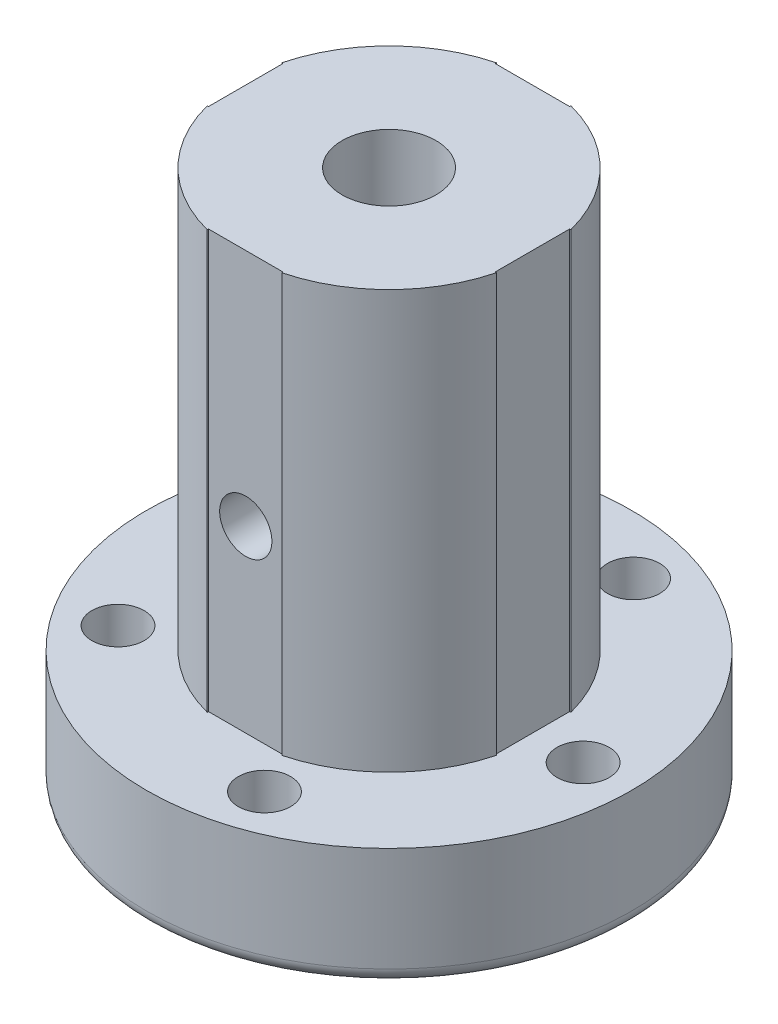
ISO-10303-21;
HEADER;
FILE_DESCRIPTION(('STEP AP214'),'2;1');
FILE_NAME('part.step','',(''),(''),'','','');
FILE_SCHEMA(('AUTOMOTIVE_DESIGN { 1 0 10303 214 1 1 1 1 }'));
ENDSEC;
DATA;
#1=APPLICATION_CONTEXT('core data for automotive mechanical design processes');
#2=APPLICATION_PROTOCOL_DEFINITION('international standard','automotive_design',2000,#1);
#3=PRODUCT_CONTEXT('',#1,'mechanical');
#4=PRODUCT('Part','Part','',(#3));
#5=PRODUCT_RELATED_PRODUCT_CATEGORY('part','',(#4));
#6=PRODUCT_DEFINITION_FORMATION('','',#4);
#7=PRODUCT_DEFINITION_CONTEXT('part definition',#1,'design');
#8=PRODUCT_DEFINITION('design','',#6,#7);
#9=PRODUCT_DEFINITION_SHAPE('','',#8);
#10=(LENGTH_UNIT() NAMED_UNIT(*) SI_UNIT(.MILLI.,.METRE.));
#11=(NAMED_UNIT(*) PLANE_ANGLE_UNIT() SI_UNIT($,.RADIAN.));
#12=(NAMED_UNIT(*) SI_UNIT($,.STERADIAN.) SOLID_ANGLE_UNIT());
#13=UNCERTAINTY_MEASURE_WITH_UNIT(LENGTH_MEASURE(1.E-05),#10,'distance_accuracy_value','');
#14=(GEOMETRIC_REPRESENTATION_CONTEXT(3) GLOBAL_UNCERTAINTY_ASSIGNED_CONTEXT((#13)) GLOBAL_UNIT_ASSIGNED_CONTEXT((#10,
#11,#12)) REPRESENTATION_CONTEXT('',''));
#15=CARTESIAN_POINT('',(0.,0.,0.));
#16=DIRECTION('',(0.,0.,1.));
#17=DIRECTION('',(1.,0.,0.));
#18=AXIS2_PLACEMENT_3D('',#15,#16,#17);
#19=CARTESIAN_POINT('',(0.,36.,0.));
#20=DIRECTION('',(0.,-1.,0.));
#21=DIRECTION('',(0.,0.,-1.));
#22=AXIS2_PLACEMENT_3D('',#19,#20,#21);
#23=CYLINDRICAL_SURFACE('',#22,10.);
#24=CARTESIAN_POINT('',(0.,36.,0.));
#25=DIRECTION('',(0.,1.,0.));
#26=DIRECTION('',(0.,0.,1.));
#27=AXIS2_PLACEMENT_3D('',#24,#25,#26);
#28=CIRCLE('',#27,10.);
#29=CARTESIAN_POINT('',(2.49999999999997,36.,9.68245836551855));
#30=VERTEX_POINT('',#29);
#31=CARTESIAN_POINT('',(9.68245836551854,36.,2.5));
#32=VERTEX_POINT('',#31);
#33=EDGE_CURVE('E315',#30,#32,#28,.T.);
#34=ORIENTED_EDGE('',*,*,#33,.F.);
#35=DIRECTION('',(0.,-1.,0.));
#36=VECTOR('',#35,1.);
#37=CARTESIAN_POINT('',(2.49999999999997,36.,9.68245836551855));
#38=LINE('',#37,#36);
#39=CARTESIAN_POINT('',(2.49999999999997,8.,9.68245836551855));
#40=VERTEX_POINT('',#39);
#41=EDGE_CURVE('E272',#30,#40,#38,.T.);
#42=ORIENTED_EDGE('',*,*,#41,.T.);
#43=CARTESIAN_POINT('',(0.,8.,0.));
#44=DIRECTION('',(0.,1.,0.));
#45=DIRECTION('',(0.,0.,1.));
#46=AXIS2_PLACEMENT_3D('',#43,#44,#45);
#47=CIRCLE('',#46,10.);
#48=CARTESIAN_POINT('',(9.68245836551854,8.,2.5));
#49=VERTEX_POINT('',#48);
#50=EDGE_CURVE('E331',#40,#49,#47,.T.);
#51=ORIENTED_EDGE('',*,*,#50,.T.);
#52=DIRECTION('',(0.,-1.,0.));
#53=VECTOR('',#52,1.);
#54=CARTESIAN_POINT('',(9.68245836551854,36.,2.5));
#55=LINE('',#54,#53);
#56=EDGE_CURVE('E299',#49,#32,#55,.F.);
#57=ORIENTED_EDGE('',*,*,#56,.T.);
#58=EDGE_LOOP('',(#34,#42,#51,#57));
#59=FACE_BOUND('',#58,.T.);
#60=ADVANCED_FACE('F47',(#59),#23,.T.);
#61=CARTESIAN_POINT('',(-9.68245836551854,8.,2.5));
#62=VERTEX_POINT('',#61);
#63=CARTESIAN_POINT('',(-2.50000000000003,8.,9.68245836551853));
#64=VERTEX_POINT('',#63);
#65=EDGE_CURVE('E410',#62,#64,#47,.T.);
#66=ORIENTED_EDGE('',*,*,#65,.T.);
#67=DIRECTION('',(0.,-1.,0.));
#68=VECTOR('',#67,1.);
#69=CARTESIAN_POINT('',(-2.50000000000003,36.,9.68245836551853));
#70=LINE('',#69,#68);
#71=CARTESIAN_POINT('',(-2.50000000000003,36.,9.68245836551853));
#72=VERTEX_POINT('',#71);
#73=EDGE_CURVE('E177',#64,#72,#70,.F.);
#74=ORIENTED_EDGE('',*,*,#73,.T.);
#75=CARTESIAN_POINT('',(-9.68245836551854,36.,2.5));
#76=VERTEX_POINT('',#75);
#77=EDGE_CURVE('E428',#76,#72,#28,.T.);
#78=ORIENTED_EDGE('',*,*,#77,.F.);
#79=DIRECTION('',(0.,-1.,0.));
#80=VECTOR('',#79,1.);
#81=CARTESIAN_POINT('',(-9.68245836551854,36.,2.5));
#82=LINE('',#81,#80);
#83=EDGE_CURVE('E266',#76,#62,#82,.T.);
#84=ORIENTED_EDGE('',*,*,#83,.T.);
#85=EDGE_LOOP('',(#66,#74,#78,#84));
#86=FACE_BOUND('',#85,.T.);
#87=ADVANCED_FACE('F376',(#86),#23,.T.);
#88=CARTESIAN_POINT('',(-2.4999999999999,8.,-9.68245836551857));
#89=VERTEX_POINT('',#88);
#90=CARTESIAN_POINT('',(-9.68245836551854,8.,-2.5));
#91=VERTEX_POINT('',#90);
#92=EDGE_CURVE('E330',#89,#91,#47,.T.);
#93=ORIENTED_EDGE('',*,*,#92,.T.);
#94=DIRECTION('',(0.,-1.,0.));
#95=VECTOR('',#94,1.);
#96=CARTESIAN_POINT('',(-9.68245836551854,36.,-2.5));
#97=LINE('',#96,#95);
#98=CARTESIAN_POINT('',(-9.68245836551854,36.,-2.5));
#99=VERTEX_POINT('',#98);
#100=EDGE_CURVE('E262',#91,#99,#97,.F.);
#101=ORIENTED_EDGE('',*,*,#100,.T.);
#102=CARTESIAN_POINT('',(-2.4999999999999,36.,-9.68245836551857));
#103=VERTEX_POINT('',#102);
#104=EDGE_CURVE('E324',#103,#99,#28,.T.);
#105=ORIENTED_EDGE('',*,*,#104,.F.);
#106=DIRECTION('',(0.,-1.,0.));
#107=VECTOR('',#106,1.);
#108=CARTESIAN_POINT('',(-2.4999999999999,36.,-9.68245836551857));
#109=LINE('',#108,#107);
#110=EDGE_CURVE('E258',#103,#89,#109,.T.);
#111=ORIENTED_EDGE('',*,*,#110,.T.);
#112=EDGE_LOOP('',(#93,#101,#105,#111));
#113=FACE_BOUND('',#112,.T.);
#114=ADVANCED_FACE('F384',(#113),#23,.T.);
#115=CARTESIAN_POINT('',(0.,8.,0.));
#116=DIRECTION('',(0.,-1.,0.));
#117=DIRECTION('',(0.,0.,-1.));
#118=AXIS2_PLACEMENT_3D('',#115,#116,#117);
#119=CYLINDRICAL_SURFACE('',#118,16.25);
#120=CARTESIAN_POINT('',(0.,1.,0.));
#121=DIRECTION('',(0.,1.,0.));
#122=DIRECTION('',(0.,0.,1.));
#123=AXIS2_PLACEMENT_3D('',#120,#121,#122);
#124=CIRCLE('',#123,16.25);
#125=CARTESIAN_POINT('',(0.,1.,16.25));
#126=VERTEX_POINT('',#125);
#127=EDGE_CURVE('E57',#126,#126,#124,.T.);
#128=ORIENTED_EDGE('',*,*,#127,.T.);
#129=EDGE_LOOP('',(#128));
#130=FACE_BOUND('',#129,.T.);
#131=CARTESIAN_POINT('',(0.,8.,0.));
#132=DIRECTION('',(0.,1.,0.));
#133=DIRECTION('',(0.,0.,1.));
#134=AXIS2_PLACEMENT_3D('',#131,#132,#133);
#135=CIRCLE('',#134,16.25);
#136=CARTESIAN_POINT('',(0.,8.,16.25));
#137=VERTEX_POINT('',#136);
#138=EDGE_CURVE('E323',#137,#137,#135,.T.);
#139=ORIENTED_EDGE('',*,*,#138,.F.);
#140=EDGE_LOOP('',(#139));
#141=FACE_BOUND('',#140,.T.);
#142=ADVANCED_FACE('F356',(#130,#141),#119,.T.);
#143=CARTESIAN_POINT('',(0.,8.,0.));
#144=DIRECTION('',(0.,1.,0.));
#145=DIRECTION('',(0.,0.,1.));
#146=AXIS2_PLACEMENT_3D('',#143,#144,#145);
#147=PLANE('',#146);
#148=CARTESIAN_POINT('',(4.01722092687428,8.,-12.363734711837));
#149=DIRECTION('',(0.,1.,0.));
#150=DIRECTION('',(0.,0.,1.));
#151=AXIS2_PLACEMENT_3D('',#148,#149,#150);
#152=CIRCLE('',#151,1.75);
#153=CARTESIAN_POINT('',(4.01722092687428,8.,-10.613734711837));
#154=VERTEX_POINT('',#153);
#155=EDGE_CURVE('E669',#154,#154,#152,.T.);
#156=ORIENTED_EDGE('',*,*,#155,.F.);
#157=EDGE_LOOP('',(#156));
#158=FACE_BOUND('',#157,.T.);
#159=CARTESIAN_POINT('',(-10.5172209268744,8.,-7.64120827980209));
#160=DIRECTION('',(0.,1.,0.));
#161=DIRECTION('',(0.,0.,1.));
#162=AXIS2_PLACEMENT_3D('',#159,#160,#161);
#163=CIRCLE('',#162,1.75);
#164=CARTESIAN_POINT('',(-10.5172209268744,8.,-5.89120827980209));
#165=VERTEX_POINT('',#164);
#166=EDGE_CURVE('E696',#165,#165,#163,.T.);
#167=ORIENTED_EDGE('',*,*,#166,.F.);
#168=EDGE_LOOP('',(#167));
#169=FACE_BOUND('',#168,.T.);
#170=CARTESIAN_POINT('',(-10.5172209268742,8.,7.64120827980224));
#171=DIRECTION('',(0.,1.,0.));
#172=DIRECTION('',(0.,0.,1.));
#173=AXIS2_PLACEMENT_3D('',#170,#171,#172);
#174=CIRCLE('',#173,1.75);
#175=CARTESIAN_POINT('',(-10.5172209268742,8.,9.39120827980224));
#176=VERTEX_POINT('',#175);
#177=EDGE_CURVE('E680',#176,#176,#174,.T.);
#178=ORIENTED_EDGE('',*,*,#177,.F.);
#179=EDGE_LOOP('',(#178));
#180=FACE_BOUND('',#179,.T.);
#181=CARTESIAN_POINT('',(4.01722092687446,8.,12.3637347118369));
#182=DIRECTION('',(0.,1.,0.));
#183=DIRECTION('',(0.,0.,1.));
#184=AXIS2_PLACEMENT_3D('',#181,#182,#183);
#185=CIRCLE('',#184,1.75);
#186=CARTESIAN_POINT('',(4.01722092687446,8.,14.1137347118369));
#187=VERTEX_POINT('',#186);
#188=EDGE_CURVE('E674',#187,#187,#185,.T.);
#189=ORIENTED_EDGE('',*,*,#188,.F.);
#190=EDGE_LOOP('',(#189));
#191=FACE_BOUND('',#190,.T.);
#192=CARTESIAN_POINT('',(13.,8.,0.));
#193=DIRECTION('',(0.,1.,0.));
#194=DIRECTION('',(0.,0.,1.));
#195=AXIS2_PLACEMENT_3D('',#192,#193,#194);
#196=CIRCLE('',#195,1.75);
#197=CARTESIAN_POINT('',(13.,8.,1.75));
#198=VERTEX_POINT('',#197);
#199=EDGE_CURVE('E706',#198,#198,#196,.T.);
#200=ORIENTED_EDGE('',*,*,#199,.F.);
#201=EDGE_LOOP('',(#200));
#202=FACE_BOUND('',#201,.T.);
#203=ORIENTED_EDGE('',*,*,#50,.F.);
#204=DIRECTION('',(0.,0.,-1.));
#205=VECTOR('',#204,1.);
#206=CARTESIAN_POINT('',(2.49999999999997,8.,9.60000000000001));
#207=LINE('',#206,#205);
#208=CARTESIAN_POINT('',(2.49999999999997,8.,9.60000000000001));
#209=VERTEX_POINT('',#208);
#210=EDGE_CURVE('E171',#40,#209,#207,.T.);
#211=ORIENTED_EDGE('',*,*,#210,.T.);
#212=DIRECTION('',(-1.,0.,0.));
#213=VECTOR('',#212,1.);
#214=CARTESIAN_POINT('',(2.49999999999997,8.,9.60000000000001));
#215=LINE('',#214,#213);
#216=CARTESIAN_POINT('',(-2.50000000000003,8.,9.59999999999999));
#217=VERTEX_POINT('',#216);
#218=EDGE_CURVE('E166',#209,#217,#215,.T.);
#219=ORIENTED_EDGE('',*,*,#218,.T.);
#220=DIRECTION('',(0.,0.,1.));
#221=VECTOR('',#220,1.);
#222=CARTESIAN_POINT('',(-2.50000000000003,8.,9.59999999999999));
#223=LINE('',#222,#221);
#224=EDGE_CURVE('E174',#217,#64,#223,.T.);
#225=ORIENTED_EDGE('',*,*,#224,.T.);
#226=ORIENTED_EDGE('',*,*,#65,.F.);
#227=DIRECTION('',(1.,0.,0.));
#228=VECTOR('',#227,1.);
#229=CARTESIAN_POINT('',(-9.6,8.,2.5));
#230=LINE('',#229,#228);
#231=CARTESIAN_POINT('',(-9.6,8.,2.5));
#232=VERTEX_POINT('',#231);
#233=EDGE_CURVE('E218',#62,#232,#230,.T.);
#234=ORIENTED_EDGE('',*,*,#233,.T.);
#235=DIRECTION('',(0.,0.,-1.));
#236=VECTOR('',#235,1.);
#237=CARTESIAN_POINT('',(-9.6,8.,2.5));
#238=LINE('',#237,#236);
#239=CARTESIAN_POINT('',(-9.6,8.,-2.5));
#240=VERTEX_POINT('',#239);
#241=EDGE_CURVE('E209',#232,#240,#238,.T.);
#242=ORIENTED_EDGE('',*,*,#241,.T.);
#243=DIRECTION('',(-1.,0.,0.));
#244=VECTOR('',#243,1.);
#245=CARTESIAN_POINT('',(-9.6,8.,-2.5));
#246=LINE('',#245,#244);
#247=EDGE_CURVE('E213',#240,#91,#246,.T.);
#248=ORIENTED_EDGE('',*,*,#247,.T.);
#249=ORIENTED_EDGE('',*,*,#92,.F.);
#250=DIRECTION('',(0.,0.,1.));
#251=VECTOR('',#250,1.);
#252=CARTESIAN_POINT('',(-2.4999999999999,8.,-9.60000000000002));
#253=LINE('',#252,#251);
#254=CARTESIAN_POINT('',(-2.4999999999999,8.,-9.60000000000002));
#255=VERTEX_POINT('',#254);
#256=EDGE_CURVE('E240',#89,#255,#253,.T.);
#257=ORIENTED_EDGE('',*,*,#256,.T.);
#258=DIRECTION('',(1.,0.,0.));
#259=VECTOR('',#258,1.);
#260=CARTESIAN_POINT('',(-2.4999999999999,8.,-9.60000000000002));
#261=LINE('',#260,#259);
#262=CARTESIAN_POINT('',(2.5000000000001,8.,-9.59999999999997));
#263=VERTEX_POINT('',#262);
#264=EDGE_CURVE('E231',#255,#263,#261,.T.);
#265=ORIENTED_EDGE('',*,*,#264,.T.);
#266=DIRECTION('',(0.,0.,-1.));
#267=VECTOR('',#266,1.);
#268=CARTESIAN_POINT('',(2.5000000000001,8.,-9.59999999999997));
#269=LINE('',#268,#267);
#270=CARTESIAN_POINT('',(2.5000000000001,8.,-9.68245836551852));
#271=VERTEX_POINT('',#270);
#272=EDGE_CURVE('E235',#263,#271,#269,.T.);
#273=ORIENTED_EDGE('',*,*,#272,.T.);
#274=CARTESIAN_POINT('',(9.68245836551854,8.,-2.5));
#275=VERTEX_POINT('',#274);
#276=EDGE_CURVE('E325',#275,#271,#47,.T.);
#277=ORIENTED_EDGE('',*,*,#276,.F.);
#278=DIRECTION('',(-1.,0.,0.));
#279=VECTOR('',#278,1.);
#280=CARTESIAN_POINT('',(9.6,8.,-2.5));
#281=LINE('',#280,#279);
#282=CARTESIAN_POINT('',(9.6,8.,-2.5));
#283=VERTEX_POINT('',#282);
#284=EDGE_CURVE('E286',#275,#283,#281,.T.);
#285=ORIENTED_EDGE('',*,*,#284,.T.);
#286=DIRECTION('',(0.,0.,1.));
#287=VECTOR('',#286,1.);
#288=CARTESIAN_POINT('',(9.6,8.,-2.5));
#289=LINE('',#288,#287);
#290=CARTESIAN_POINT('',(9.6,8.,2.5));
#291=VERTEX_POINT('',#290);
#292=EDGE_CURVE('E277',#283,#291,#289,.T.);
#293=ORIENTED_EDGE('',*,*,#292,.T.);
#294=DIRECTION('',(1.,0.,0.));
#295=VECTOR('',#294,1.);
#296=CARTESIAN_POINT('',(9.6,8.,2.5));
#297=LINE('',#296,#295);
#298=EDGE_CURVE('E281',#291,#49,#297,.T.);
#299=ORIENTED_EDGE('',*,*,#298,.T.);
#300=EDGE_LOOP('',(#203,#211,#219,#225,#226,#234,#242,#248,#249,#257,#265,#273,#277,#285,#293,#299));
#301=FACE_BOUND('',#300,.T.);
#302=ORIENTED_EDGE('',*,*,#138,.T.);
#303=EDGE_LOOP('',(#302));
#304=FACE_BOUND('',#303,.T.);
#305=ADVANCED_FACE('F184',(#158,#169,#180,#191,#202,#301,#304),#147,.T.);
#306=CARTESIAN_POINT('',(0.,0.,0.));
#307=DIRECTION('',(0.,1.,0.));
#308=DIRECTION('',(0.,0.,1.));
#309=AXIS2_PLACEMENT_3D('',#306,#307,#308);
#310=PLANE('',#309);
#311=CARTESIAN_POINT('',(4.01722092687428,0.,-12.363734711837));
#312=DIRECTION('',(0.,-1.,0.));
#313=DIRECTION('',(-0.951056516295155,0.,-0.309016994374945));
#314=AXIS2_PLACEMENT_3D('',#311,#312,#313);
#315=CIRCLE('',#314,1.75);
#316=CARTESIAN_POINT('',(2.35287202335776,0.,-12.9045144519932));
#317=VERTEX_POINT('',#316);
#318=EDGE_CURVE('E672',#317,#317,#315,.T.);
#319=ORIENTED_EDGE('',*,*,#318,.F.);
#320=EDGE_LOOP('',(#319));
#321=FACE_BOUND('',#320,.T.);
#322=CARTESIAN_POINT('',(-10.5172209268744,0.,-7.64120827980209));
#323=DIRECTION('',(0.,-1.,0.));
#324=DIRECTION('',(-0.587785252292469,0.,0.809016994374951));
#325=AXIS2_PLACEMENT_3D('',#322,#323,#324);
#326=CIRCLE('',#325,1.75);
#327=CARTESIAN_POINT('',(-11.5458451183862,0.,-6.22542853964593));
#328=VERTEX_POINT('',#327);
#329=EDGE_CURVE('E675',#328,#328,#326,.T.);
#330=ORIENTED_EDGE('',*,*,#329,.F.);
#331=EDGE_LOOP('',(#330));
#332=FACE_BOUND('',#331,.T.);
#333=CARTESIAN_POINT('',(-10.5172209268742,0.,7.64120827980224));
#334=DIRECTION('',(0.,-1.,0.));
#335=DIRECTION('',(0.58778525229248,0.,0.809016994374942));
#336=AXIS2_PLACEMENT_3D('',#333,#334,#335);
#337=CIRCLE('',#336,1.75);
#338=CARTESIAN_POINT('',(-9.48859673536241,0.,9.05698801995839));
#339=VERTEX_POINT('',#338);
#340=EDGE_CURVE('E683',#339,#339,#337,.T.);
#341=ORIENTED_EDGE('',*,*,#340,.F.);
#342=EDGE_LOOP('',(#341));
#343=FACE_BOUND('',#342,.T.);
#344=CARTESIAN_POINT('',(4.01722092687446,0.,12.3637347118369));
#345=DIRECTION('',(0.,-1.,0.));
#346=DIRECTION('',(0.95105651629515,0.,-0.309016994374958));
#347=AXIS2_PLACEMENT_3D('',#344,#345,#346);
#348=CIRCLE('',#347,1.75);
#349=CARTESIAN_POINT('',(5.68156983039097,0.,11.8229549716808));
#350=VERTEX_POINT('',#349);
#351=EDGE_CURVE('E689',#350,#350,#348,.T.);
#352=ORIENTED_EDGE('',*,*,#351,.F.);
#353=EDGE_LOOP('',(#352));
#354=FACE_BOUND('',#353,.T.);
#355=CARTESIAN_POINT('',(13.,0.,0.));
#356=DIRECTION('',(0.,-1.,0.));
#357=DIRECTION('',(0.,0.,-1.));
#358=AXIS2_PLACEMENT_3D('',#355,#356,#357);
#359=CIRCLE('',#358,1.75);
#360=CARTESIAN_POINT('',(13.,0.,-1.75));
#361=VERTEX_POINT('',#360);
#362=EDGE_CURVE('E702',#361,#361,#359,.T.);
#363=ORIENTED_EDGE('',*,*,#362,.F.);
#364=EDGE_LOOP('',(#363));
#365=FACE_BOUND('',#364,.T.);
#366=CARTESIAN_POINT('',(0.,0.,0.));
#367=DIRECTION('',(0.,-1.,0.));
#368=DIRECTION('',(0.,0.,-1.));
#369=AXIS2_PLACEMENT_3D('',#366,#367,#368);
#370=CIRCLE('',#369,1.75);
#371=CARTESIAN_POINT('',(0.,0.,-1.75));
#372=VERTEX_POINT('',#371);
#373=EDGE_CURVE('E709',#372,#372,#370,.T.);
#374=ORIENTED_EDGE('',*,*,#373,.F.);
#375=EDGE_LOOP('',(#374));
#376=FACE_BOUND('',#375,.T.);
#377=CARTESIAN_POINT('',(0.,0.,0.));
#378=DIRECTION('',(0.,1.,0.));
#379=DIRECTION('',(0.,0.,1.));
#380=AXIS2_PLACEMENT_3D('',#377,#378,#379);
#381=CIRCLE('',#380,15.25);
#382=CARTESIAN_POINT('',(0.,0.,15.25));
#383=VERTEX_POINT('',#382);
#384=EDGE_CURVE('E12',#383,#383,#381,.F.);
#385=ORIENTED_EDGE('',*,*,#384,.T.);
#386=EDGE_LOOP('',(#385));
#387=FACE_BOUND('',#386,.T.);
#388=ADVANCED_FACE('F391',(#321,#332,#343,#354,#365,#376,#387),#310,.F.);
#389=ORIENTED_EDGE('',*,*,#276,.T.);
#390=DIRECTION('',(0.,-1.,0.));
#391=VECTOR('',#390,1.);
#392=CARTESIAN_POINT('',(2.5000000000001,36.,-9.68245836551852));
#393=LINE('',#392,#391);
#394=CARTESIAN_POINT('',(2.5000000000001,36.,-9.68245836551852));
#395=VERTEX_POINT('',#394);
#396=EDGE_CURVE('E207',#271,#395,#393,.F.);
#397=ORIENTED_EDGE('',*,*,#396,.T.);
#398=CARTESIAN_POINT('',(9.68245836551854,36.,-2.5));
#399=VERTEX_POINT('',#398);
#400=EDGE_CURVE('E319',#399,#395,#28,.T.);
#401=ORIENTED_EDGE('',*,*,#400,.F.);
#402=DIRECTION('',(0.,-1.,0.));
#403=VECTOR('',#402,1.);
#404=CARTESIAN_POINT('',(9.68245836551854,36.,-2.5));
#405=LINE('',#404,#403);
#406=EDGE_CURVE('E306',#399,#275,#405,.T.);
#407=ORIENTED_EDGE('',*,*,#406,.T.);
#408=EDGE_LOOP('',(#389,#397,#401,#407));
#409=FACE_BOUND('',#408,.T.);
#410=ADVANCED_FACE('F379',(#409),#23,.T.);
#411=CARTESIAN_POINT('',(0.,36.,0.));
#412=DIRECTION('',(0.,1.,0.));
#413=DIRECTION('',(0.,0.,1.));
#414=AXIS2_PLACEMENT_3D('',#411,#412,#413);
#415=PLANE('',#414);
#416=DIRECTION('',(0.,0.,-1.));
#417=VECTOR('',#416,1.);
#418=CARTESIAN_POINT('',(2.5,36.,0.));
#419=LINE('',#418,#417);
#420=CARTESIAN_POINT('',(2.49999999999997,36.,9.60000000000001));
#421=VERTEX_POINT('',#420);
#422=EDGE_CURVE('E343',#30,#421,#419,.T.);
#423=ORIENTED_EDGE('',*,*,#422,.F.);
#424=ORIENTED_EDGE('',*,*,#33,.T.);
#425=DIRECTION('',(1.,0.,0.));
#426=VECTOR('',#425,1.);
#427=CARTESIAN_POINT('',(9.6,36.,2.5));
#428=LINE('',#427,#426);
#429=CARTESIAN_POINT('',(9.6,36.,2.5));
#430=VERTEX_POINT('',#429);
#431=EDGE_CURVE('E282',#430,#32,#428,.T.);
#432=ORIENTED_EDGE('',*,*,#431,.F.);
#433=DIRECTION('',(0.,0.,1.));
#434=VECTOR('',#433,1.);
#435=CARTESIAN_POINT('',(9.6,36.,-2.5));
#436=LINE('',#435,#434);
#437=CARTESIAN_POINT('',(9.6,36.,-2.5));
#438=VERTEX_POINT('',#437);
#439=EDGE_CURVE('E276',#438,#430,#436,.T.);
#440=ORIENTED_EDGE('',*,*,#439,.F.);
#441=DIRECTION('',(-1.,0.,0.));
#442=VECTOR('',#441,1.);
#443=CARTESIAN_POINT('',(0.,36.,-2.5));
#444=LINE('',#443,#442);
#445=EDGE_CURVE('E329',#399,#438,#444,.T.);
#446=ORIENTED_EDGE('',*,*,#445,.F.);
#447=ORIENTED_EDGE('',*,*,#400,.T.);
#448=DIRECTION('',(0.,0.,-1.));
#449=VECTOR('',#448,1.);
#450=CARTESIAN_POINT('',(2.5000000000001,36.,-9.59999999999997));
#451=LINE('',#450,#449);
#452=CARTESIAN_POINT('',(2.5000000000001,36.,-9.59999999999997));
#453=VERTEX_POINT('',#452);
#454=EDGE_CURVE('E236',#453,#395,#451,.T.);
#455=ORIENTED_EDGE('',*,*,#454,.F.);
#456=DIRECTION('',(1.,0.,0.));
#457=VECTOR('',#456,1.);
#458=CARTESIAN_POINT('',(-2.4999999999999,36.,-9.60000000000002));
#459=LINE('',#458,#457);
#460=CARTESIAN_POINT('',(-2.4999999999999,36.,-9.60000000000002));
#461=VERTEX_POINT('',#460);
#462=EDGE_CURVE('E244',#461,#453,#459,.T.);
#463=ORIENTED_EDGE('',*,*,#462,.F.);
#464=DIRECTION('',(0.,0.,1.));
#465=VECTOR('',#464,1.);
#466=CARTESIAN_POINT('',(-2.5,36.,0.));
#467=LINE('',#466,#465);
#468=EDGE_CURVE('E337',#103,#461,#467,.T.);
#469=ORIENTED_EDGE('',*,*,#468,.F.);
#470=ORIENTED_EDGE('',*,*,#104,.T.);
#471=DIRECTION('',(-1.,0.,0.));
#472=VECTOR('',#471,1.);
#473=CARTESIAN_POINT('',(-9.6,36.,-2.5));
#474=LINE('',#473,#472);
#475=CARTESIAN_POINT('',(-9.6,36.,-2.5));
#476=VERTEX_POINT('',#475);
#477=EDGE_CURVE('E214',#476,#99,#474,.T.);
#478=ORIENTED_EDGE('',*,*,#477,.F.);
#479=DIRECTION('',(0.,0.,-1.));
#480=VECTOR('',#479,1.);
#481=CARTESIAN_POINT('',(-9.6,36.,2.5));
#482=LINE('',#481,#480);
#483=CARTESIAN_POINT('',(-9.6,36.,2.5));
#484=VERTEX_POINT('',#483);
#485=EDGE_CURVE('E72',#484,#476,#482,.T.);
#486=ORIENTED_EDGE('',*,*,#485,.F.);
#487=DIRECTION('',(1.,0.,0.));
#488=VECTOR('',#487,1.);
#489=CARTESIAN_POINT('',(0.,36.,2.5));
#490=LINE('',#489,#488);
#491=EDGE_CURVE('E340',#76,#484,#490,.T.);
#492=ORIENTED_EDGE('',*,*,#491,.F.);
#493=ORIENTED_EDGE('',*,*,#77,.T.);
#494=DIRECTION('',(0.,0.,1.));
#495=VECTOR('',#494,1.);
#496=CARTESIAN_POINT('',(-2.50000000000003,36.,9.59999999999999));
#497=LINE('',#496,#495);
#498=CARTESIAN_POINT('',(-2.50000000000003,36.,9.59999999999999));
#499=VERTEX_POINT('',#498);
#500=EDGE_CURVE('E188',#499,#72,#497,.T.);
#501=ORIENTED_EDGE('',*,*,#500,.F.);
#502=DIRECTION('',(-1.,0.,0.));
#503=VECTOR('',#502,1.);
#504=CARTESIAN_POINT('',(2.49999999999997,36.,9.60000000000001));
#505=LINE('',#504,#503);
#506=EDGE_CURVE('E64',#421,#499,#505,.T.);
#507=ORIENTED_EDGE('',*,*,#506,.F.);
#508=EDGE_LOOP('',(#423,#424,#432,#440,#446,#447,#455,#463,#469,#470,#478,#486,#492,#493,#501,#507));
#509=FACE_BOUND('',#508,.T.);
#510=CARTESIAN_POINT('',(0.,36.,0.));
#511=DIRECTION('',(0.,1.,0.));
#512=DIRECTION('',(0.,0.,1.));
#513=AXIS2_PLACEMENT_3D('',#510,#511,#512);
#514=CIRCLE('',#513,3.15);
#515=CARTESIAN_POINT('',(0.,36.,3.15));
#516=VERTEX_POINT('',#515);
#517=EDGE_CURVE('E310',#516,#516,#514,.T.);
#518=ORIENTED_EDGE('',*,*,#517,.F.);
#519=EDGE_LOOP('',(#518));
#520=FACE_BOUND('',#519,.T.);
#521=ADVANCED_FACE('F390',(#509,#520),#415,.T.);
#522=CARTESIAN_POINT('',(0.,11.,0.));
#523=DIRECTION('',(0.,1.,0.));
#524=DIRECTION('',(0.,0.,1.));
#525=AXIS2_PLACEMENT_3D('',#522,#523,#524);
#526=CYLINDRICAL_SURFACE('',#525,3.15);
#527=CARTESIAN_POINT('',(0.,18.25,3.15));
#528=CARTESIAN_POINT('',(0.0908306631453699,18.2499974343662,3.15000220125733));
#529=CARTESIAN_POINT('',(0.181646533632519,18.2571025992498,3.14603778930233));
#530=CARTESIAN_POINT('',(0.360455265967408,18.2851343030303,3.13059551533736));
#531=CARTESIAN_POINT('',(0.448447600732194,18.3060634069495,3.11911625895662));
#532=CARTESIAN_POINT('',(0.618861135859099,18.3606421099457,3.08981698941828));
#533=CARTESIAN_POINT('',(0.701301507198813,18.3942449778856,3.07202028418502));
#534=CARTESIAN_POINT('',(0.859221802306144,18.4729021682049,3.03164803949125));
#535=CARTESIAN_POINT('',(0.934700047651745,18.5179592421697,3.00907135197807));
#536=CARTESIAN_POINT('',(1.08243530600515,18.6217606777521,2.95927787006389));
#537=CARTESIAN_POINT('',(1.15410333889271,18.6812389534172,2.93184758174702));
#538=CARTESIAN_POINT('',(1.28701161931488,18.8105828671568,2.87598831418861));
#539=CARTESIAN_POINT('',(1.34824121682551,18.880458979348,2.84755835024977));
#540=CARTESIAN_POINT('',(1.46479944731566,19.0370206471619,2.78953672476529));
#541=CARTESIAN_POINT('',(1.5189011749424,19.124692070845,2.76011932834907));
#542=CARTESIAN_POINT('',(1.61135577830616,19.3095839738922,2.70719183433593));
#543=CARTESIAN_POINT('',(1.64973120071795,19.4067905330695,2.6836732985051));
#544=CARTESIAN_POINT('',(1.70259753882444,19.5870400560634,2.65036311233076));
#545=CARTESIAN_POINT('',(1.72041294764456,19.6687667750146,2.63872543700674));
#546=CARTESIAN_POINT('',(1.74417509658551,19.8346149473811,2.62308315552618));
#547=CARTESIAN_POINT('',(1.75013353602955,19.9187339570805,2.61907102538676));
#548=CARTESIAN_POINT('',(1.7498617166432,20.0870317666208,2.61925248795083));
#549=CARTESIAN_POINT('',(1.74361811078401,20.1712105311399,2.62345506619386));
#550=CARTESIAN_POINT('',(1.71927313540129,20.3371045568803,2.63947037562976));
#551=CARTESIAN_POINT('',(1.70116405536868,20.418818180043,2.65128805524075));
#552=CARTESIAN_POINT('',(1.65394355496535,20.5778025735952,2.68099596934514));
#553=CARTESIAN_POINT('',(1.62482968843728,20.6550723517988,2.69888755386339));
#554=CARTESIAN_POINT('',(1.55659179790614,20.8038852666984,2.73881024285204));
#555=CARTESIAN_POINT('',(1.51746386418599,20.8754261523507,2.76084296322061));
#556=CARTESIAN_POINT('',(1.42342504456199,21.0222893067375,2.81062247566481));
#557=CARTESIAN_POINT('',(1.36701929427476,21.0965340773922,2.83872879617778));
#558=CARTESIAN_POINT('',(1.2431777764198,21.2351758668431,2.89510685434703));
#559=CARTESIAN_POINT('',(1.17573330426977,21.2995650358325,2.92337870542989));
#560=CARTESIAN_POINT('',(1.02349730118524,21.423204265214,2.98030186379878));
#561=CARTESIAN_POINT('',(0.937640312749935,21.4812715344852,3.00870106421646));
#562=CARTESIAN_POINT('',(0.755634618286717,21.5818673841206,3.0594798854143));
#563=CARTESIAN_POINT('',(0.6594927409845,21.6244061929315,3.08186346605226));
#564=CARTESIAN_POINT('',(0.466723618308807,21.6894575850969,3.11665965442235));
#565=CARTESIAN_POINT('',(0.370614219031374,21.7131763385735,3.12966675667262));
#566=CARTESIAN_POINT('',(0.175016930877013,21.744031593671,3.1466607285681));
#567=CARTESIAN_POINT('',(0.075532104875706,21.7511827409935,3.15065556494046));
#568=CARTESIAN_POINT('',(-0.111815894443025,21.748646746807,3.14924953991988));
#569=CARTESIAN_POINT('',(-0.199718228999806,21.7407762760784,3.14486231541959));
#570=CARTESIAN_POINT('',(-0.372722972539552,21.7120936998831,3.12907672406685));
#571=CARTESIAN_POINT('',(-0.457825290441757,21.691281173866,3.11767812938106));
#572=CARTESIAN_POINT('',(-0.622738229503323,21.6377400827293,3.08896206481101));
#573=CARTESIAN_POINT('',(-0.702567092582786,21.605055446093,3.07166642909525));
#574=CARTESIAN_POINT('',(-0.855697142018711,21.5289216723551,3.03257902634695));
#575=CARTESIAN_POINT('',(-0.928996574424538,21.4854696546783,3.01078605641316));
#576=CARTESIAN_POINT('',(-1.07510957471672,21.3839614657142,2.96195328953488));
#577=CARTESIAN_POINT('',(-1.14709387595378,21.3248614734682,2.93460419406603));
#578=CARTESIAN_POINT('',(-1.28067739776103,21.1962348487483,2.8788222205273));
#579=CARTESIAN_POINT('',(-1.3422650460138,21.1266967583006,2.850388177407));
#580=CARTESIAN_POINT('',(-1.45958373029232,20.9708568466697,2.79227803636129));
#581=CARTESIAN_POINT('',(-1.51410010976575,20.8835720127328,2.76276528872727));
#582=CARTESIAN_POINT('',(-1.60746552825331,20.6994087391342,2.70951283955335));
#583=CARTESIAN_POINT('',(-1.64633672659222,20.6025441121154,2.68576499186536));
#584=CARTESIAN_POINT('',(-1.70022222837416,20.4226481209225,2.65189333130193));
#585=CARTESIAN_POINT('',(-1.71852020297929,20.3409411093647,2.63996160703263));
#586=CARTESIAN_POINT('',(-1.74323748005079,20.1750373538597,2.62370951910806));
#587=CARTESIAN_POINT('',(-1.74966864788797,20.0908431824714,2.61938155282244));
#588=CARTESIAN_POINT('',(-1.75030673364247,19.9222847700082,2.61895523749626));
#589=CARTESIAN_POINT('',(-1.74449843333148,19.8379204476643,2.62286713367845));
#590=CARTESIAN_POINT('',(-1.7209615022129,19.6715824103112,2.63836726753851));
#591=CARTESIAN_POINT('',(-1.70322525948724,19.5896102567602,2.64996040699729));
#592=CARTESIAN_POINT('',(-1.65675638243963,19.4303267942061,2.67925374067223));
#593=CARTESIAN_POINT('',(-1.6280569708692,19.3530022126548,2.69693546824629));
#594=CARTESIAN_POINT('',(-1.5606460941487,19.2040242015356,2.7364955624136));
#595=CARTESIAN_POINT('',(-1.52193077222644,19.1323729704856,2.75837554476576));
#596=CARTESIAN_POINT('',(-1.42883483783945,18.9853063951967,2.80786512296215));
#597=CARTESIAN_POINT('',(-1.37297273753835,18.9109509109025,2.83584127239367));
#598=CARTESIAN_POINT('',(-1.25024151723212,18.7719934173755,2.89205074732486));
#599=CARTESIAN_POINT('',(-1.18336350558538,18.7073993686451,2.9202842630266));
#600=CARTESIAN_POINT('',(-1.03213506372698,18.5830511464922,2.9773108523551));
#601=CARTESIAN_POINT('',(-0.946690450473618,18.5245010479498,3.00585614188502));
#602=CARTESIAN_POINT('',(-0.765443989564136,18.4228614546345,3.05703060403071));
#603=CARTESIAN_POINT('',(-0.669649764758773,18.3797606805673,3.07966408946728));
#604=CARTESIAN_POINT('',(-0.479376259324923,18.3142099933962,3.11467385752647));
#605=CARTESIAN_POINT('',(-0.385557627360383,18.2902481463037,3.12779114300612));
#606=CARTESIAN_POINT('',(-0.194485178266826,18.2581507220169,3.14544967682427));
#607=CARTESIAN_POINT('',(-0.0972341131797704,18.2500027465079,3.14999764355674));
#608=CARTESIAN_POINT('',(0.,18.25,3.15));
#609=B_SPLINE_CURVE_WITH_KNOTS('',3,(#527,#528,#529,#530,#531,#532,#533,#534,#535,#536,#537,
#538,#539,#540,#541,#542,#543,#544,#545,#546,#547,#548,#549,#550,#551,#552,#553,#554,#555,#556,
#557,#558,#559,#560,#561,#562,#563,#564,#565,#566,#567,#568,#569,#570,#571,#572,#573,#574,#575,
#576,#577,#578,#579,#580,#581,#582,#583,#584,#585,#586,#587,#588,#589,#590,#591,#592,#593,#594,
#595,#596,#597,#598,#599,#600,#601,#602,#603,#604,#605,#606,#607,#608),.UNSPECIFIED.,.T.,.F.,(4,
2,2,2,2,2,2,2,2,2,2,2,2,2,2,2,2,2,2,2,2,2,2,2,2,2,2,2,2,2,2,2,2,2,2,2,2,2,2,2,4),(0.,
0.272114885635136,0.544280276191409,0.815451787346336,1.08668850231121,1.37678656466248,
1.66717885671187,1.98700086995826,2.30636273918525,2.55861323654448,2.8106147135831,
3.06289199303617,3.31533337195766,3.56783089688607,3.82042715331353,4.11140943111122,
4.40262227830958,4.72335832506183,5.04388272323588,5.34167861473182,5.63921115516491,
5.9030197454659,6.16683690863686,6.4296876925198,6.69260887239263,6.98263772540953,
7.27298730534953,7.5925809194312,7.91172026498863,8.16434712797714,8.41672125750944,
8.66940936744738,8.92225888566509,9.17434817123535,9.4265346723149,9.71672394284559,
10.0071486018081,10.3278104444356,10.6482376980535,10.9397650027354,11.2310636531196),.UNSPECIFIED.);
#610=CARTESIAN_POINT('',(0.,18.25,3.15));
#611=VERTEX_POINT('',#610);
#612=EDGE_CURVE('E193',#611,#611,#609,.T.);
#613=ORIENTED_EDGE('',*,*,#612,.T.);
#614=EDGE_LOOP('',(#613));
#615=FACE_BOUND('',#614,.T.);
#616=CARTESIAN_POINT('',(-1.74999999999997,20.,-2.61916017074178));
#617=CARTESIAN_POINT('',(-1.74999326836974,20.0895098233643,-2.61916966487453));
#618=CARTESIAN_POINT('',(-1.74308464367969,20.1790935826053,-2.62382160877729));
#619=CARTESIAN_POINT('',(-1.71586651871725,20.3553752670245,-2.64169420578612));
#620=CARTESIAN_POINT('',(-1.69553498697793,20.4420682012296,-2.65492894548864));
#621=CARTESIAN_POINT('',(-1.64270771486753,20.6096617573728,-2.68792945002682));
#622=CARTESIAN_POINT('',(-1.61028921984595,20.6905953557973,-2.7076536498777));
#623=CARTESIAN_POINT('',(-1.53444602880479,20.8458421535158,-2.75134261443954));
#624=CARTESIAN_POINT('',(-1.49101888814046,20.9201538773568,-2.77530832068715));
#625=CARTESIAN_POINT('',(-1.3891489302553,21.0684917153624,-2.82778581715072));
#626=CARTESIAN_POINT('',(-1.32961845967565,21.141695508506,-2.85651148643171));
#627=CARTESIAN_POINT('',(-1.19947625584898,21.2777424274282,-2.91355609810577));
#628=CARTESIAN_POINT('',(-1.1288577878805,21.3405792085211,-2.94187478181486));
#629=CARTESIAN_POINT('',(-0.970968966585404,21.4595628839947,-2.99788748393257));
#630=CARTESIAN_POINT('',(-0.882779587763993,21.5146322312932,-3.02530652740246));
#631=CARTESIAN_POINT('',(-0.696575901597676,21.608769163862,-3.07351600493375));
#632=CARTESIAN_POINT('',(-0.598569306786259,21.6478491897094,-3.09431158961085));
#633=CARTESIAN_POINT('',(-0.404279718317632,21.7054139823856,-3.12536436020608));
#634=CARTESIAN_POINT('',(-0.308551314022302,21.725360424116,-3.13636376433037));
#635=CARTESIAN_POINT('',(-0.114531857997985,21.7489741393624,-3.14941388605499));
#636=CARTESIAN_POINT('',(-0.0162428573901453,21.752654062634,-3.15147155722639));
#637=CARTESIAN_POINT('',(0.168825235198404,21.7440335593598,-3.14668867046904));
#638=CARTESIAN_POINT('',(0.25571268393594,21.7333975292852,-3.14077478895905));
#639=CARTESIAN_POINT('',(0.426234538918947,21.6995236736334,-3.12220756657887));
#640=CARTESIAN_POINT('',(0.509868693875001,21.6762848766624,-3.10955370620714));
#641=CARTESIAN_POINT('',(0.672685726553732,21.6178866368366,-3.07846422670747));
#642=CARTESIAN_POINT('',(0.751813816395298,21.5826067526301,-3.05997033802899));
#643=CARTESIAN_POINT('',(0.903175534006519,21.5013858308463,-3.01876392626668));
#644=CARTESIAN_POINT('',(0.975406986035007,21.455441444429,-2.9960500784901));
#645=CARTESIAN_POINT('',(1.11936687021144,21.3484859791186,-2.94549723504997));
#646=CARTESIAN_POINT('',(1.19017836304385,21.2863772789682,-2.91736942091156));
#647=CARTESIAN_POINT('',(1.3209267670697,21.1517267074843,-2.86054984601188));
#648=CARTESIAN_POINT('',(1.38085202833368,21.0791738063086,-2.83185751709095));
#649=CARTESIAN_POINT('',(1.49356198540402,20.91777799911,-2.7741904530376));
#650=CARTESIAN_POINT('',(1.54520556852454,20.8280543605029,-2.74542627442607));
#651=CARTESIAN_POINT('',(1.63233026012293,20.6393467850706,-2.69454302782005));
#652=CARTESIAN_POINT('',(1.66783009546728,20.540373739188,-2.67241627056585));
#653=CARTESIAN_POINT('',(1.71857196724421,20.344134591444,-2.64004875738722));
#654=CARTESIAN_POINT('',(1.73521408232786,20.2473718381146,-2.62899492378375));
#655=CARTESIAN_POINT('',(1.75197227355613,20.0518461175709,-2.61786425798163));
#656=CARTESIAN_POINT('',(1.75210833311649,19.9530857138138,-2.6177741523065));
#657=CARTESIAN_POINT('',(1.73713056360492,19.7722894594877,-2.62772136589137));
#658=CARTESIAN_POINT('',(1.72429737216583,19.6899638304799,-2.63624411196923));
#659=CARTESIAN_POINT('',(1.68741550511717,19.5288734175586,-2.66000127917137));
#660=CARTESIAN_POINT('',(1.66336170511688,19.4501102786624,-2.67523876670536));
#661=CARTESIAN_POINT('',(1.60377762967943,19.2945760276414,-2.71139300277747));
#662=CARTESIAN_POINT('',(1.56781490467426,19.2180210837702,-2.73251808118182));
#663=CARTESIAN_POINT('',(1.48579155293668,19.0715732306266,-2.77797079028631));
#664=CARTESIAN_POINT('',(1.43972599724645,19.001683597183,-2.80229998188294));
#665=CARTESIAN_POINT('',(1.33011809886414,18.8586561397092,-2.85614906517464));
#666=CARTESIAN_POINT('',(1.26495270096015,18.7868321085384,-2.88587054644513));
#667=CARTESIAN_POINT('',(1.12329628720237,18.6546005628899,-2.94390361615813));
#668=CARTESIAN_POINT('',(1.04679832442427,18.5942001031977,-2.97221432546267));
#669=CARTESIAN_POINT('',(0.879382303251227,18.4834969076898,-3.02610612136804));
#670=CARTESIAN_POINT('',(0.787909831618186,18.4339123376817,-3.05145838181767));
#671=CARTESIAN_POINT('',(0.596121514721591,18.3513625897412,-3.09463446714001));
#672=CARTESIAN_POINT('',(0.495815135157603,18.318379871168,-3.11246623452501));
#673=CARTESIAN_POINT('',(0.300293076743791,18.2733465518731,-3.13703963900516));
#674=CARTESIAN_POINT('',(0.205612871900491,18.2594938011952,-3.14473231291837));
#675=CARTESIAN_POINT('',(0.0149737626525169,18.2474643221288,-3.15140472161725));
#676=CARTESIAN_POINT('',(-0.0809844079692964,18.2492789550861,-3.15038925788253));
#677=CARTESIAN_POINT('',(-0.262036220516229,18.2675599286676,-3.1402712276164));
#678=CARTESIAN_POINT('',(-0.347316011553598,18.2826603172647,-3.13192272476078));
#679=CARTESIAN_POINT('',(-0.513917015395731,18.324954434281,-3.108932799457));
#680=CARTESIAN_POINT('',(-0.595237763678175,18.3521495780258,-3.09429064053328));
#681=CARTESIAN_POINT('',(-0.754703402886476,18.4186605901472,-3.0593803119339));
#682=CARTESIAN_POINT('',(-0.832656183338859,18.4583453120208,-3.03894311287932));
#683=CARTESIAN_POINT('',(-0.981042372952416,18.5482456692585,-2.99433937314766));
#684=CARTESIAN_POINT('',(-1.05147280213582,18.5984654549055,-2.97017136371379));
#685=CARTESIAN_POINT('',(-1.19152499498864,18.7147034339299,-2.91702049811176));
#686=CARTESIAN_POINT('',(-1.26009806770265,18.7818802084661,-2.88780465948472));
#687=CARTESIAN_POINT('',(-1.38553439635663,18.9266947143602,-2.82976728055323));
#688=CARTESIAN_POINT('',(-1.44238295262633,19.0043453781839,-2.80094627701175));
#689=CARTESIAN_POINT('',(-1.54660701545414,19.1746697773858,-2.74485890147453));
#690=CARTESIAN_POINT('',(-1.59302880231227,19.2680174658575,-2.71784644496199));
#691=CARTESIAN_POINT('',(-1.66886625952865,19.4631086071331,-2.67196249126616));
#692=CARTESIAN_POINT('',(-1.69833548137709,19.5648244489186,-2.65306540690252));
#693=CARTESIAN_POINT('',(-1.72886282971947,19.7232303974843,-2.63318733988148));
#694=CARTESIAN_POINT('',(-1.73676844257042,19.7781442751121,-2.62796033128911));
#695=CARTESIAN_POINT('',(-1.74733898265171,19.8886959288657,-2.62094388520342));
#696=CARTESIAN_POINT('',(-1.75000418641392,19.9443336666379,-2.61915426632214));
#697=CARTESIAN_POINT('',(-1.74999999999997,20.,-2.61916017074178));
#698=B_SPLINE_CURVE_WITH_KNOTS('',3,(#616,#617,#618,#619,#620,#621,#622,#623,#624,#625,#626,
#627,#628,#629,#630,#631,#632,#633,#634,#635,#636,#637,#638,#639,#640,#641,#642,#643,#644,#645,
#646,#647,#648,#649,#650,#651,#652,#653,#654,#655,#656,#657,#658,#659,#660,#661,#662,#663,#664,
#665,#666,#667,#668,#669,#670,#671,#672,#673,#674,#675,#676,#677,#678,#679,#680,#681,#682,#683,
#684,#685,#686,#687,#688,#689,#690,#691,#692,#693,#694,#695,#696,#697),.UNSPECIFIED.,.T.,.F.,(4,
2,2,2,2,2,2,2,2,2,2,2,2,2,2,2,2,2,2,2,2,2,2,2,2,2,2,2,2,2,2,2,2,2,2,2,2,2,2,2,4),(0.,
0.268292768184935,0.537026992716024,0.804072435174431,1.07117723134645,1.36587131073518,
1.66074508130219,1.98160475879274,2.30221431276487,2.59572281030928,2.88900301901291,
3.15096728651167,3.41295174851582,3.67763749211224,3.94240646436744,4.23609919314679,
4.53010438992383,4.85078383691553,5.17109033850823,5.46562596121223,5.75980499438432,
6.00993037006243,6.26017008863806,6.52073151017647,6.78142033804972,7.0844188431781,
7.38760386257847,7.70710174776525,8.02626135602725,8.31263651474141,8.59885378251529,
8.85868871899241,9.11855406930207,9.38695686605807,9.65546559919608,9.95523348077748,
10.2553749432264,10.5767332900237,10.8970708427243,11.0639314427594,11.2307832374683),.UNSPECIFIED.);
#699=CARTESIAN_POINT('',(-1.74999999999997,20.,-2.61916017074178));
#700=VERTEX_POINT('',#699);
#701=EDGE_CURVE('E350',#700,#700,#698,.T.);
#702=ORIENTED_EDGE('',*,*,#701,.T.);
#703=EDGE_LOOP('',(#702));
#704=FACE_BOUND('',#703,.T.);
#705=CARTESIAN_POINT('',(0.,11.,0.));
#706=DIRECTION('',(0.,1.,0.));
#707=DIRECTION('',(0.,0.,1.));
#708=AXIS2_PLACEMENT_3D('',#705,#706,#707);
#709=CIRCLE('',#708,3.15);
#710=CARTESIAN_POINT('',(0.,11.,3.15));
#711=VERTEX_POINT('',#710);
#712=EDGE_CURVE('E311',#711,#711,#709,.T.);
#713=ORIENTED_EDGE('',*,*,#712,.F.);
#714=EDGE_LOOP('',(#713));
#715=FACE_BOUND('',#714,.T.);
#716=ORIENTED_EDGE('',*,*,#517,.T.);
#717=EDGE_LOOP('',(#716));
#718=FACE_BOUND('',#717,.T.);
#719=ADVANCED_FACE('F397',(#615,#704,#715,#718),#526,.F.);
#720=CARTESIAN_POINT('',(0.,11.,0.));
#721=DIRECTION('',(0.,1.,0.));
#722=DIRECTION('',(0.,0.,1.));
#723=AXIS2_PLACEMENT_3D('',#720,#721,#722);
#724=PLANE('',#723);
#725=CARTESIAN_POINT('',(0.,11.,0.));
#726=DIRECTION('',(0.,1.,0.));
#727=DIRECTION('',(0.,0.,1.));
#728=AXIS2_PLACEMENT_3D('',#725,#726,#727);
#729=CIRCLE('',#728,1.75);
#730=CARTESIAN_POINT('',(0.,11.,1.75));
#731=VERTEX_POINT('',#730);
#732=EDGE_CURVE('E51',#731,#731,#729,.T.);
#733=ORIENTED_EDGE('',*,*,#732,.F.);
#734=EDGE_LOOP('',(#733));
#735=FACE_BOUND('',#734,.T.);
#736=ORIENTED_EDGE('',*,*,#712,.T.);
#737=EDGE_LOOP('',(#736));
#738=FACE_BOUND('',#737,.T.);
#739=ADVANCED_FACE('F465',(#735,#738),#724,.T.);
#740=CARTESIAN_POINT('',(9.6,8.,-2.5));
#741=DIRECTION('',(0.,0.,-1.));
#742=DIRECTION('',(-1.,0.,0.));
#743=AXIS2_PLACEMENT_3D('',#740,#741,#742);
#744=PLANE('',#743);
#745=ORIENTED_EDGE('',*,*,#445,.T.);
#746=DIRECTION('',(0.,1.,0.));
#747=VECTOR('',#746,1.);
#748=CARTESIAN_POINT('',(9.6,8.,-2.5));
#749=LINE('',#748,#747);
#750=EDGE_CURVE('E295',#283,#438,#749,.T.);
#751=ORIENTED_EDGE('',*,*,#750,.F.);
#752=ORIENTED_EDGE('',*,*,#284,.F.);
#753=ORIENTED_EDGE('',*,*,#406,.F.);
#754=EDGE_LOOP('',(#745,#751,#752,#753));
#755=FACE_BOUND('',#754,.T.);
#756=ADVANCED_FACE('F448',(#755),#744,.F.);
#757=CARTESIAN_POINT('',(9.6,8.,2.5));
#758=DIRECTION('',(0.,0.,1.));
#759=DIRECTION('',(1.,0.,0.));
#760=AXIS2_PLACEMENT_3D('',#757,#758,#759);
#761=PLANE('',#760);
#762=ORIENTED_EDGE('',*,*,#298,.F.);
#763=DIRECTION('',(0.,1.,0.));
#764=VECTOR('',#763,1.);
#765=CARTESIAN_POINT('',(9.6,8.,2.5));
#766=LINE('',#765,#764);
#767=EDGE_CURVE('E289',#291,#430,#766,.T.);
#768=ORIENTED_EDGE('',*,*,#767,.T.);
#769=ORIENTED_EDGE('',*,*,#431,.T.);
#770=ORIENTED_EDGE('',*,*,#56,.F.);
#771=EDGE_LOOP('',(#762,#768,#769,#770));
#772=FACE_BOUND('',#771,.T.);
#773=ADVANCED_FACE('F416',(#772),#761,.F.);
#774=CARTESIAN_POINT('',(9.6,8.,-2.5));
#775=DIRECTION('',(-1.,0.,0.));
#776=DIRECTION('',(0.,0.,1.));
#777=AXIS2_PLACEMENT_3D('',#774,#775,#776);
#778=PLANE('',#777);
#779=ORIENTED_EDGE('',*,*,#439,.T.);
#780=ORIENTED_EDGE('',*,*,#767,.F.);
#781=ORIENTED_EDGE('',*,*,#292,.F.);
#782=ORIENTED_EDGE('',*,*,#750,.T.);
#783=EDGE_LOOP('',(#779,#780,#781,#782));
#784=FACE_BOUND('',#783,.T.);
#785=ADVANCED_FACE('F422',(#784),#778,.F.);
#786=CARTESIAN_POINT('',(-2.4999999999999,8.,-9.60000000000002));
#787=DIRECTION('',(-1.,0.,0.));
#788=DIRECTION('',(0.,0.,1.));
#789=AXIS2_PLACEMENT_3D('',#786,#787,#788);
#790=PLANE('',#789);
#791=ORIENTED_EDGE('',*,*,#468,.T.);
#792=DIRECTION('',(0.,1.,0.));
#793=VECTOR('',#792,1.);
#794=CARTESIAN_POINT('',(-2.4999999999999,8.,-9.60000000000002));
#795=LINE('',#794,#793);
#796=EDGE_CURVE('E224',#255,#461,#795,.T.);
#797=ORIENTED_EDGE('',*,*,#796,.F.);
#798=ORIENTED_EDGE('',*,*,#256,.F.);
#799=ORIENTED_EDGE('',*,*,#110,.F.);
#800=EDGE_LOOP('',(#791,#797,#798,#799));
#801=FACE_BOUND('',#800,.T.);
#802=ADVANCED_FACE('F440',(#801),#790,.F.);
#803=CARTESIAN_POINT('',(2.5000000000001,8.,-9.59999999999997));
#804=DIRECTION('',(1.,0.,0.));
#805=DIRECTION('',(0.,0.,-1.));
#806=AXIS2_PLACEMENT_3D('',#803,#804,#805);
#807=PLANE('',#806);
#808=ORIENTED_EDGE('',*,*,#272,.F.);
#809=DIRECTION('',(0.,1.,0.));
#810=VECTOR('',#809,1.);
#811=CARTESIAN_POINT('',(2.5000000000001,8.,-9.59999999999997));
#812=LINE('',#811,#810);
#813=EDGE_CURVE('E243',#263,#453,#812,.T.);
#814=ORIENTED_EDGE('',*,*,#813,.T.);
#815=ORIENTED_EDGE('',*,*,#454,.T.);
#816=ORIENTED_EDGE('',*,*,#396,.F.);
#817=EDGE_LOOP('',(#808,#814,#815,#816));
#818=FACE_BOUND('',#817,.T.);
#819=ADVANCED_FACE('F449',(#818),#807,.F.);
#820=CARTESIAN_POINT('',(-2.4999999999999,8.,-9.60000000000002));
#821=DIRECTION('',(0.,0.,1.));
#822=DIRECTION('',(1.,0.,0.));
#823=AXIS2_PLACEMENT_3D('',#820,#821,#822);
#824=PLANE('',#823);
#825=CARTESIAN_POINT('',(1.00554662558682E-13,20.,-9.6));
#826=DIRECTION('',(0.,0.,-1.));
#827=DIRECTION('',(-1.,0.,0.));
#828=AXIS2_PLACEMENT_3D('',#825,#826,#827);
#829=CIRCLE('',#828,1.75);
#830=CARTESIAN_POINT('',(-1.7499999999999,20.,-9.60000000000002));
#831=VERTEX_POINT('',#830);
#832=EDGE_CURVE('E351',#831,#831,#829,.T.);
#833=ORIENTED_EDGE('',*,*,#832,.F.);
#834=EDGE_LOOP('',(#833));
#835=FACE_BOUND('',#834,.T.);
#836=ORIENTED_EDGE('',*,*,#462,.T.);
#837=ORIENTED_EDGE('',*,*,#813,.F.);
#838=ORIENTED_EDGE('',*,*,#264,.F.);
#839=ORIENTED_EDGE('',*,*,#796,.T.);
#840=EDGE_LOOP('',(#836,#837,#838,#839));
#841=FACE_BOUND('',#840,.T.);
#842=ADVANCED_FACE('F443',(#835,#841),#824,.F.);
#843=CARTESIAN_POINT('',(-9.6,8.,2.5));
#844=DIRECTION('',(0.,0.,1.));
#845=DIRECTION('',(1.,0.,0.));
#846=AXIS2_PLACEMENT_3D('',#843,#844,#845);
#847=PLANE('',#846);
#848=ORIENTED_EDGE('',*,*,#491,.T.);
#849=DIRECTION('',(0.,1.,0.));
#850=VECTOR('',#849,1.);
#851=CARTESIAN_POINT('',(-9.6,8.,2.5));
#852=LINE('',#851,#850);
#853=EDGE_CURVE('E204',#232,#484,#852,.T.);
#854=ORIENTED_EDGE('',*,*,#853,.F.);
#855=ORIENTED_EDGE('',*,*,#233,.F.);
#856=ORIENTED_EDGE('',*,*,#83,.F.);
#857=EDGE_LOOP('',(#848,#854,#855,#856));
#858=FACE_BOUND('',#857,.T.);
#859=ADVANCED_FACE('F457',(#858),#847,.F.);
#860=CARTESIAN_POINT('',(-9.6,8.,-2.5));
#861=DIRECTION('',(0.,0.,-1.));
#862=DIRECTION('',(-1.,0.,0.));
#863=AXIS2_PLACEMENT_3D('',#860,#861,#862);
#864=PLANE('',#863);
#865=ORIENTED_EDGE('',*,*,#247,.F.);
#866=DIRECTION('',(0.,1.,0.));
#867=VECTOR('',#866,1.);
#868=CARTESIAN_POINT('',(-9.6,8.,-2.5));
#869=LINE('',#868,#867);
#870=EDGE_CURVE('E221',#240,#476,#869,.T.);
#871=ORIENTED_EDGE('',*,*,#870,.T.);
#872=ORIENTED_EDGE('',*,*,#477,.T.);
#873=ORIENTED_EDGE('',*,*,#100,.F.);
#874=EDGE_LOOP('',(#865,#871,#872,#873));
#875=FACE_BOUND('',#874,.T.);
#876=ADVANCED_FACE('F498',(#875),#864,.F.);
#877=CARTESIAN_POINT('',(-9.6,8.,2.5));
#878=DIRECTION('',(1.,0.,0.));
#879=DIRECTION('',(0.,0.,-1.));
#880=AXIS2_PLACEMENT_3D('',#877,#878,#879);
#881=PLANE('',#880);
#882=ORIENTED_EDGE('',*,*,#485,.T.);
#883=ORIENTED_EDGE('',*,*,#870,.F.);
#884=ORIENTED_EDGE('',*,*,#241,.F.);
#885=ORIENTED_EDGE('',*,*,#853,.T.);
#886=EDGE_LOOP('',(#882,#883,#884,#885));
#887=FACE_BOUND('',#886,.T.);
#888=ADVANCED_FACE('F490',(#887),#881,.F.);
#889=CARTESIAN_POINT('',(2.49999999999997,8.,9.60000000000001));
#890=DIRECTION('',(1.,0.,0.));
#891=DIRECTION('',(0.,0.,-1.));
#892=AXIS2_PLACEMENT_3D('',#889,#890,#891);
#893=PLANE('',#892);
#894=ORIENTED_EDGE('',*,*,#422,.T.);
#895=DIRECTION('',(0.,1.,0.));
#896=VECTOR('',#895,1.);
#897=CARTESIAN_POINT('',(2.49999999999997,8.,9.60000000000001));
#898=LINE('',#897,#896);
#899=EDGE_CURVE('E170',#209,#421,#898,.T.);
#900=ORIENTED_EDGE('',*,*,#899,.F.);
#901=ORIENTED_EDGE('',*,*,#210,.F.);
#902=ORIENTED_EDGE('',*,*,#41,.F.);
#903=EDGE_LOOP('',(#894,#900,#901,#902));
#904=FACE_BOUND('',#903,.T.);
#905=ADVANCED_FACE('F486',(#904),#893,.F.);
#906=CARTESIAN_POINT('',(-2.50000000000003,8.,9.59999999999999));
#907=DIRECTION('',(-1.,0.,0.));
#908=DIRECTION('',(0.,0.,1.));
#909=AXIS2_PLACEMENT_3D('',#906,#907,#908);
#910=PLANE('',#909);
#911=ORIENTED_EDGE('',*,*,#224,.F.);
#912=DIRECTION('',(0.,1.,0.));
#913=VECTOR('',#912,1.);
#914=CARTESIAN_POINT('',(-2.50000000000003,8.,9.59999999999999));
#915=LINE('',#914,#913);
#916=EDGE_CURVE('E162',#217,#499,#915,.T.);
#917=ORIENTED_EDGE('',*,*,#916,.T.);
#918=ORIENTED_EDGE('',*,*,#500,.T.);
#919=ORIENTED_EDGE('',*,*,#73,.F.);
#920=EDGE_LOOP('',(#911,#917,#918,#919));
#921=FACE_BOUND('',#920,.T.);
#922=ADVANCED_FACE('F175',(#921),#910,.F.);
#923=CARTESIAN_POINT('',(2.49999999999997,8.,9.60000000000001));
#924=DIRECTION('',(0.,0.,-1.));
#925=DIRECTION('',(-1.,0.,0.));
#926=AXIS2_PLACEMENT_3D('',#923,#924,#925);
#927=PLANE('',#926);
#928=CARTESIAN_POINT('',(-1.00554662558682E-13,20.,9.6));
#929=DIRECTION('',(0.,0.,-1.));
#930=DIRECTION('',(-1.,0.,0.));
#931=AXIS2_PLACEMENT_3D('',#928,#929,#930);
#932=CIRCLE('',#931,1.75);
#933=CARTESIAN_POINT('',(-1.7500000000001,20.,9.59999999999999));
#934=VERTEX_POINT('',#933);
#935=EDGE_CURVE('E346',#934,#934,#932,.T.);
#936=ORIENTED_EDGE('',*,*,#935,.T.);
#937=EDGE_LOOP('',(#936));
#938=FACE_BOUND('',#937,.T.);
#939=ORIENTED_EDGE('',*,*,#506,.T.);
#940=ORIENTED_EDGE('',*,*,#916,.F.);
#941=ORIENTED_EDGE('',*,*,#218,.F.);
#942=ORIENTED_EDGE('',*,*,#899,.T.);
#943=EDGE_LOOP('',(#939,#940,#941,#942));
#944=FACE_BOUND('',#943,.T.);
#945=ADVANCED_FACE('F164',(#938,#944),#927,.F.);
#946=CARTESIAN_POINT('',(-1.61306437854553E-13,20.,15.4));
#947=DIRECTION('',(0.,0.,-1.));
#948=DIRECTION('',(-1.,0.,0.));
#949=AXIS2_PLACEMENT_3D('',#946,#947,#948);
#950=CYLINDRICAL_SURFACE('',#949,1.75);
#951=ORIENTED_EDGE('',*,*,#935,.F.);
#952=EDGE_LOOP('',(#951));
#953=FACE_BOUND('',#952,.T.);
#954=ORIENTED_EDGE('',*,*,#612,.F.);
#955=EDGE_LOOP('',(#954));
#956=FACE_BOUND('',#955,.T.);
#957=ADVANCED_FACE('F372',(#953,#956),#950,.F.);
#958=ORIENTED_EDGE('',*,*,#832,.T.);
#959=EDGE_LOOP('',(#958));
#960=FACE_BOUND('',#959,.T.);
#961=ORIENTED_EDGE('',*,*,#701,.F.);
#962=EDGE_LOOP('',(#961));
#963=FACE_BOUND('',#962,.T.);
#964=ADVANCED_FACE('F361',(#960,#963),#950,.F.);
#965=CARTESIAN_POINT('',(0.,1.,0.));
#966=DIRECTION('',(0.,1.,0.));
#967=DIRECTION('',(0.,0.,1.));
#968=AXIS2_PLACEMENT_3D('',#965,#966,#967);
#969=TOROIDAL_SURFACE('',#968,15.25,1.);
#970=ORIENTED_EDGE('',*,*,#384,.F.);
#971=EDGE_LOOP('',(#970));
#972=FACE_BOUND('',#971,.T.);
#973=ORIENTED_EDGE('',*,*,#127,.F.);
#974=EDGE_LOOP('',(#973));
#975=FACE_BOUND('',#974,.T.);
#976=ADVANCED_FACE('F49',(#972,#975),#969,.T.);
#977=CARTESIAN_POINT('',(0.,25.,0.));
#978=DIRECTION('',(0.,-1.,0.));
#979=DIRECTION('',(0.,0.,-1.));
#980=AXIS2_PLACEMENT_3D('',#977,#978,#979);
#981=CYLINDRICAL_SURFACE('',#980,1.75);
#982=ORIENTED_EDGE('',*,*,#732,.T.);
#983=EDGE_LOOP('',(#982));
#984=FACE_BOUND('',#983,.T.);
#985=ORIENTED_EDGE('',*,*,#373,.T.);
#986=EDGE_LOOP('',(#985));
#987=FACE_BOUND('',#986,.T.);
#988=ADVANCED_FACE('F360',(#984,#987),#981,.F.);
#989=CARTESIAN_POINT('',(13.,10.,0.));
#990=DIRECTION('',(0.,-1.,0.));
#991=DIRECTION('',(0.,0.,-1.));
#992=AXIS2_PLACEMENT_3D('',#989,#990,#991);
#993=CYLINDRICAL_SURFACE('',#992,1.75);
#994=ORIENTED_EDGE('',*,*,#199,.T.);
#995=EDGE_LOOP('',(#994));
#996=FACE_BOUND('',#995,.T.);
#997=ORIENTED_EDGE('',*,*,#362,.T.);
#998=EDGE_LOOP('',(#997));
#999=FACE_BOUND('',#998,.T.);
#1000=ADVANCED_FACE('F368',(#996,#999),#993,.F.);
#1001=CARTESIAN_POINT('',(4.01722092687446,10.,12.3637347118369));
#1002=DIRECTION('',(0.,-1.,0.));
#1003=DIRECTION('',(0.,0.,-1.));
#1004=AXIS2_PLACEMENT_3D('',#1001,#1002,#1003);
#1005=CYLINDRICAL_SURFACE('',#1004,1.75);
#1006=ORIENTED_EDGE('',*,*,#188,.T.);
#1007=EDGE_LOOP('',(#1006));
#1008=FACE_BOUND('',#1007,.T.);
#1009=ORIENTED_EDGE('',*,*,#351,.T.);
#1010=EDGE_LOOP('',(#1009));
#1011=FACE_BOUND('',#1010,.T.);
#1012=ADVANCED_FACE('F625',(#1008,#1011),#1005,.F.);
#1013=CARTESIAN_POINT('',(-10.5172209268742,10.,7.64120827980224));
#1014=DIRECTION('',(0.,-1.,0.));
#1015=DIRECTION('',(0.,0.,-1.));
#1016=AXIS2_PLACEMENT_3D('',#1013,#1014,#1015);
#1017=CYLINDRICAL_SURFACE('',#1016,1.75);
#1018=ORIENTED_EDGE('',*,*,#177,.T.);
#1019=EDGE_LOOP('',(#1018));
#1020=FACE_BOUND('',#1019,.T.);
#1021=ORIENTED_EDGE('',*,*,#340,.T.);
#1022=EDGE_LOOP('',(#1021));
#1023=FACE_BOUND('',#1022,.T.);
#1024=ADVANCED_FACE('F632',(#1020,#1023),#1017,.F.);
#1025=CARTESIAN_POINT('',(-10.5172209268744,10.,-7.64120827980209));
#1026=DIRECTION('',(0.,-1.,0.));
#1027=DIRECTION('',(0.,0.,-1.));
#1028=AXIS2_PLACEMENT_3D('',#1025,#1026,#1027);
#1029=CYLINDRICAL_SURFACE('',#1028,1.75);
#1030=ORIENTED_EDGE('',*,*,#166,.T.);
#1031=EDGE_LOOP('',(#1030));
#1032=FACE_BOUND('',#1031,.T.);
#1033=ORIENTED_EDGE('',*,*,#329,.T.);
#1034=EDGE_LOOP('',(#1033));
#1035=FACE_BOUND('',#1034,.T.);
#1036=ADVANCED_FACE('F641',(#1032,#1035),#1029,.F.);
#1037=CARTESIAN_POINT('',(4.01722092687428,10.,-12.363734711837));
#1038=DIRECTION('',(0.,-1.,0.));
#1039=DIRECTION('',(0.,0.,-1.));
#1040=AXIS2_PLACEMENT_3D('',#1037,#1038,#1039);
#1041=CYLINDRICAL_SURFACE('',#1040,1.75);
#1042=ORIENTED_EDGE('',*,*,#155,.T.);
#1043=EDGE_LOOP('',(#1042));
#1044=FACE_BOUND('',#1043,.T.);
#1045=ORIENTED_EDGE('',*,*,#318,.T.);
#1046=EDGE_LOOP('',(#1045));
#1047=FACE_BOUND('',#1046,.T.);
#1048=ADVANCED_FACE('F650',(#1044,#1047),#1041,.F.);
#1049=CLOSED_SHELL('',(#60,#87,#114,#142,#305,#388,#410,#521,#719,#739,#756,#773,#785,#802,#819,
#842,#859,#876,#888,#905,#922,#945,#957,#964,#976,#988,#1000,#1012,#1024,#1036,#1048));
#1050=MANIFOLD_SOLID_BREP('B2',#1049);
#1051=ADVANCED_BREP_SHAPE_REPRESENTATION('',(#18,#1050),#14);
#1052=SHAPE_DEFINITION_REPRESENTATION(#9,#1051);
ENDSEC;
END-ISO-10303-21;
